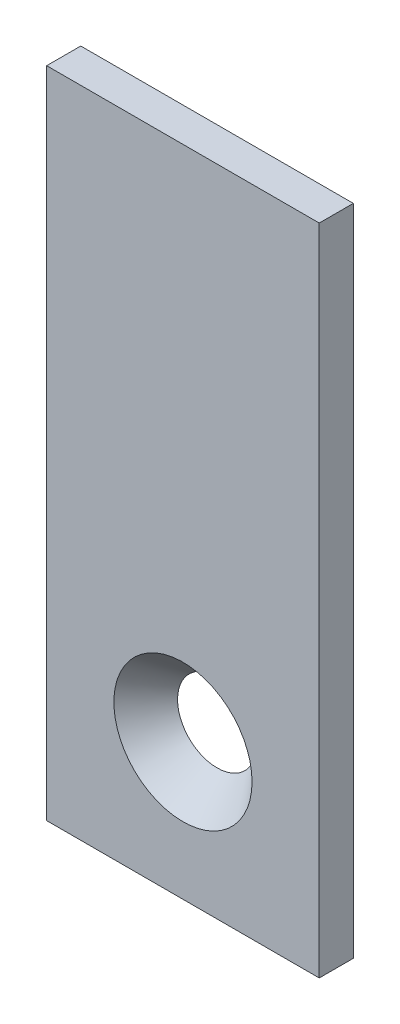
ISO-10303-21;
HEADER;
FILE_DESCRIPTION(('STEP AP214'),'2;1');
FILE_NAME('part.step','',(''),(''),'','','');
FILE_SCHEMA(('AUTOMOTIVE_DESIGN { 1 0 10303 214 1 1 1 1 }'));
ENDSEC;
DATA;
#1=APPLICATION_CONTEXT('core data for automotive mechanical design processes');
#2=APPLICATION_PROTOCOL_DEFINITION('international standard','automotive_design',2000,#1);
#3=PRODUCT_CONTEXT('',#1,'mechanical');
#4=PRODUCT('Part','Part','',(#3));
#5=PRODUCT_RELATED_PRODUCT_CATEGORY('part','',(#4));
#6=PRODUCT_DEFINITION_FORMATION('','',#4);
#7=PRODUCT_DEFINITION_CONTEXT('part definition',#1,'design');
#8=PRODUCT_DEFINITION('design','',#6,#7);
#9=PRODUCT_DEFINITION_SHAPE('','',#8);
#10=(LENGTH_UNIT() NAMED_UNIT(*) SI_UNIT(.MILLI.,.METRE.));
#11=(NAMED_UNIT(*) PLANE_ANGLE_UNIT() SI_UNIT($,.RADIAN.));
#12=(NAMED_UNIT(*) SI_UNIT($,.STERADIAN.) SOLID_ANGLE_UNIT());
#13=UNCERTAINTY_MEASURE_WITH_UNIT(LENGTH_MEASURE(1.E-05),#10,'distance_accuracy_value','');
#14=(GEOMETRIC_REPRESENTATION_CONTEXT(3) GLOBAL_UNCERTAINTY_ASSIGNED_CONTEXT((#13)) GLOBAL_UNIT_ASSIGNED_CONTEXT((#10,
#11,#12)) REPRESENTATION_CONTEXT('',''));
#15=CARTESIAN_POINT('',(0.,0.,0.));
#16=DIRECTION('',(0.,0.,1.));
#17=DIRECTION('',(1.,0.,0.));
#18=AXIS2_PLACEMENT_3D('',#15,#16,#17);
#19=CARTESIAN_POINT('',(0.,0.,-1.5875));
#20=DIRECTION('',(0.,0.,-1.));
#21=DIRECTION('',(-1.,0.,0.));
#22=AXIS2_PLACEMENT_3D('',#19,#20,#21);
#23=PLANE('',#22);
#24=CARTESIAN_POINT('',(0.,-17.7643536,-1.5875));
#25=DIRECTION('',(0.,0.,-1.));
#26=DIRECTION('',(-1.,0.,0.));
#27=AXIS2_PLACEMENT_3D('',#24,#25,#26);
#28=CIRCLE('',#27,3.67891460743348);
#29=CARTESIAN_POINT('',(-3.67891460743348,-17.7643536,-1.5875));
#30=VERTEX_POINT('',#29);
#31=EDGE_CURVE('E42',#30,#30,#28,.T.);
#32=ORIENTED_EDGE('',*,*,#31,.F.);
#33=EDGE_LOOP('',(#32));
#34=FACE_BOUND('',#33,.T.);
#35=DIRECTION('',(0.,1.,0.));
#36=VECTOR('',#35,1.);
#37=CARTESIAN_POINT('',(12.7,-30.4643536,-1.5875));
#38=LINE('',#37,#36);
#39=CARTESIAN_POINT('',(12.7,-30.4643536,-1.5875));
#40=VERTEX_POINT('',#39);
#41=CARTESIAN_POINT('',(12.7,30.4643536,-1.5875));
#42=VERTEX_POINT('',#41);
#43=EDGE_CURVE('E109',#40,#42,#38,.T.);
#44=ORIENTED_EDGE('',*,*,#43,.F.);
#45=DIRECTION('',(1.,0.,0.));
#46=VECTOR('',#45,1.);
#47=CARTESIAN_POINT('',(-12.7,-30.4643536,-1.5875));
#48=LINE('',#47,#46);
#49=CARTESIAN_POINT('',(-12.7,-30.4643536,-1.5875));
#50=VERTEX_POINT('',#49);
#51=EDGE_CURVE('E80',#50,#40,#48,.T.);
#52=ORIENTED_EDGE('',*,*,#51,.F.);
#53=DIRECTION('',(0.,-1.,0.));
#54=VECTOR('',#53,1.);
#55=CARTESIAN_POINT('',(-12.7,-30.4643536,-1.5875));
#56=LINE('',#55,#54);
#57=CARTESIAN_POINT('',(-12.7,30.4643536,-1.5875));
#58=VERTEX_POINT('',#57);
#59=EDGE_CURVE('E74',#58,#50,#56,.T.);
#60=ORIENTED_EDGE('',*,*,#59,.F.);
#61=DIRECTION('',(-1.,0.,0.));
#62=VECTOR('',#61,1.);
#63=CARTESIAN_POINT('',(-12.7,30.4643536,-1.5875));
#64=LINE('',#63,#62);
#65=EDGE_CURVE('E97',#42,#58,#64,.T.);
#66=ORIENTED_EDGE('',*,*,#65,.F.);
#67=EDGE_LOOP('',(#44,#52,#60,#66));
#68=FACE_BOUND('',#67,.T.);
#69=ADVANCED_FACE('F38',(#34,#68),#23,.T.);
#70=CARTESIAN_POINT('',(12.7,-30.4643536,1.5875));
#71=DIRECTION('',(-1.,0.,0.));
#72=DIRECTION('',(0.,0.,1.));
#73=AXIS2_PLACEMENT_3D('',#70,#71,#72);
#74=PLANE('',#73);
#75=ORIENTED_EDGE('',*,*,#43,.T.);
#76=DIRECTION('',(0.,0.,-1.));
#77=VECTOR('',#76,1.);
#78=CARTESIAN_POINT('',(12.7,30.4643536,1.5875));
#79=LINE('',#78,#77);
#80=CARTESIAN_POINT('',(12.7,30.4643536,1.5875));
#81=VERTEX_POINT('',#80);
#82=EDGE_CURVE('E11',#81,#42,#79,.T.);
#83=ORIENTED_EDGE('',*,*,#82,.F.);
#84=DIRECTION('',(0.,1.,0.));
#85=VECTOR('',#84,1.);
#86=CARTESIAN_POINT('',(12.7,-30.4643536,1.5875));
#87=LINE('',#86,#85);
#88=CARTESIAN_POINT('',(12.7,-30.4643536,1.5875));
#89=VERTEX_POINT('',#88);
#90=EDGE_CURVE('E92',#89,#81,#87,.T.);
#91=ORIENTED_EDGE('',*,*,#90,.F.);
#92=DIRECTION('',(0.,0.,-1.));
#93=VECTOR('',#92,1.);
#94=CARTESIAN_POINT('',(12.7,-30.4643536,1.5875));
#95=LINE('',#94,#93);
#96=EDGE_CURVE('E105',#89,#40,#95,.T.);
#97=ORIENTED_EDGE('',*,*,#96,.T.);
#98=EDGE_LOOP('',(#75,#83,#91,#97));
#99=FACE_BOUND('',#98,.T.);
#100=ADVANCED_FACE('F40',(#99),#74,.F.);
#101=CARTESIAN_POINT('',(-12.7,30.4643536,1.5875));
#102=DIRECTION('',(0.,-1.,0.));
#103=DIRECTION('',(0.,0.,-1.));
#104=AXIS2_PLACEMENT_3D('',#101,#102,#103);
#105=PLANE('',#104);
#106=ORIENTED_EDGE('',*,*,#65,.T.);
#107=DIRECTION('',(0.,0.,-1.));
#108=VECTOR('',#107,1.);
#109=CARTESIAN_POINT('',(-12.7,30.4643536,1.5875));
#110=LINE('',#109,#108);
#111=CARTESIAN_POINT('',(-12.7,30.4643536,1.5875));
#112=VERTEX_POINT('',#111);
#113=EDGE_CURVE('E49',#112,#58,#110,.T.);
#114=ORIENTED_EDGE('',*,*,#113,.F.);
#115=DIRECTION('',(-1.,0.,0.));
#116=VECTOR('',#115,1.);
#117=CARTESIAN_POINT('',(-12.7,30.4643536,1.5875));
#118=LINE('',#117,#116);
#119=EDGE_CURVE('E87',#81,#112,#118,.T.);
#120=ORIENTED_EDGE('',*,*,#119,.F.);
#121=ORIENTED_EDGE('',*,*,#82,.T.);
#122=EDGE_LOOP('',(#106,#114,#120,#121));
#123=FACE_BOUND('',#122,.T.);
#124=ADVANCED_FACE('F96',(#123),#105,.F.);
#125=CARTESIAN_POINT('',(-12.7,-30.4643536,1.5875));
#126=DIRECTION('',(1.,0.,0.));
#127=DIRECTION('',(0.,0.,-1.));
#128=AXIS2_PLACEMENT_3D('',#125,#126,#127);
#129=PLANE('',#128);
#130=ORIENTED_EDGE('',*,*,#59,.T.);
#131=DIRECTION('',(0.,0.,-1.));
#132=VECTOR('',#131,1.);
#133=CARTESIAN_POINT('',(-12.7,-30.4643536,1.5875));
#134=LINE('',#133,#132);
#135=CARTESIAN_POINT('',(-12.7,-30.4643536,1.5875));
#136=VERTEX_POINT('',#135);
#137=EDGE_CURVE('E99',#136,#50,#134,.T.);
#138=ORIENTED_EDGE('',*,*,#137,.F.);
#139=DIRECTION('',(0.,-1.,0.));
#140=VECTOR('',#139,1.);
#141=CARTESIAN_POINT('',(-12.7,-30.4643536,1.5875));
#142=LINE('',#141,#140);
#143=EDGE_CURVE('E90',#112,#136,#142,.T.);
#144=ORIENTED_EDGE('',*,*,#143,.F.);
#145=ORIENTED_EDGE('',*,*,#113,.T.);
#146=EDGE_LOOP('',(#130,#138,#144,#145));
#147=FACE_BOUND('',#146,.T.);
#148=ADVANCED_FACE('F101',(#147),#129,.F.);
#149=CARTESIAN_POINT('',(-12.7,-30.4643536,1.5875));
#150=DIRECTION('',(0.,1.,0.));
#151=DIRECTION('',(0.,0.,1.));
#152=AXIS2_PLACEMENT_3D('',#149,#150,#151);
#153=PLANE('',#152);
#154=ORIENTED_EDGE('',*,*,#51,.T.);
#155=ORIENTED_EDGE('',*,*,#96,.F.);
#156=DIRECTION('',(1.,0.,0.));
#157=VECTOR('',#156,1.);
#158=CARTESIAN_POINT('',(-12.7,-30.4643536,1.5875));
#159=LINE('',#158,#157);
#160=EDGE_CURVE('E57',#136,#89,#159,.T.);
#161=ORIENTED_EDGE('',*,*,#160,.F.);
#162=ORIENTED_EDGE('',*,*,#137,.T.);
#163=EDGE_LOOP('',(#154,#155,#161,#162));
#164=FACE_BOUND('',#163,.T.);
#165=ADVANCED_FACE('F122',(#164),#153,.F.);
#166=CARTESIAN_POINT('',(0.,0.,1.5875));
#167=DIRECTION('',(0.,0.,-1.));
#168=DIRECTION('',(-1.,0.,0.));
#169=AXIS2_PLACEMENT_3D('',#166,#167,#168);
#170=PLANE('',#169);
#171=CARTESIAN_POINT('',(0.,-17.7643536,1.5875));
#172=DIRECTION('',(0.,0.,1.));
#173=DIRECTION('',(1.,0.,0.));
#174=AXIS2_PLACEMENT_3D('',#171,#172,#173);
#175=CIRCLE('',#174,6.4389);
#176=CARTESIAN_POINT('',(6.4389,-17.7643536,1.5875));
#177=VERTEX_POINT('',#176);
#178=EDGE_CURVE('E128',#177,#177,#175,.T.);
#179=ORIENTED_EDGE('',*,*,#178,.F.);
#180=EDGE_LOOP('',(#179));
#181=FACE_BOUND('',#180,.T.);
#182=ORIENTED_EDGE('',*,*,#90,.T.);
#183=ORIENTED_EDGE('',*,*,#119,.T.);
#184=ORIENTED_EDGE('',*,*,#143,.T.);
#185=ORIENTED_EDGE('',*,*,#160,.T.);
#186=EDGE_LOOP('',(#182,#183,#184,#185));
#187=FACE_BOUND('',#186,.T.);
#188=ADVANCED_FACE('F88',(#181,#187),#170,.F.);
#189=CARTESIAN_POINT('',(0.,-17.7643536,1.5875));
#190=DIRECTION('',(0.,0.,1.));
#191=DIRECTION('',(1.,0.,0.));
#192=AXIS2_PLACEMENT_3D('',#189,#190,#191);
#193=CONICAL_SURFACE('',#192,6.4389,0.715584993317676);
#194=ORIENTED_EDGE('',*,*,#31,.T.);
#195=EDGE_LOOP('',(#194));
#196=FACE_BOUND('',#195,.T.);
#197=ORIENTED_EDGE('',*,*,#178,.T.);
#198=EDGE_LOOP('',(#197));
#199=FACE_BOUND('',#198,.T.);
#200=ADVANCED_FACE('F137',(#196,#199),#193,.F.);
#201=CLOSED_SHELL('',(#69,#100,#124,#148,#165,#188,#200));
#202=MANIFOLD_SOLID_BREP('B2',#201);
#203=ADVANCED_BREP_SHAPE_REPRESENTATION('',(#18,#202),#14);
#204=SHAPE_DEFINITION_REPRESENTATION(#9,#203);
ENDSEC;
END-ISO-10303-21;
